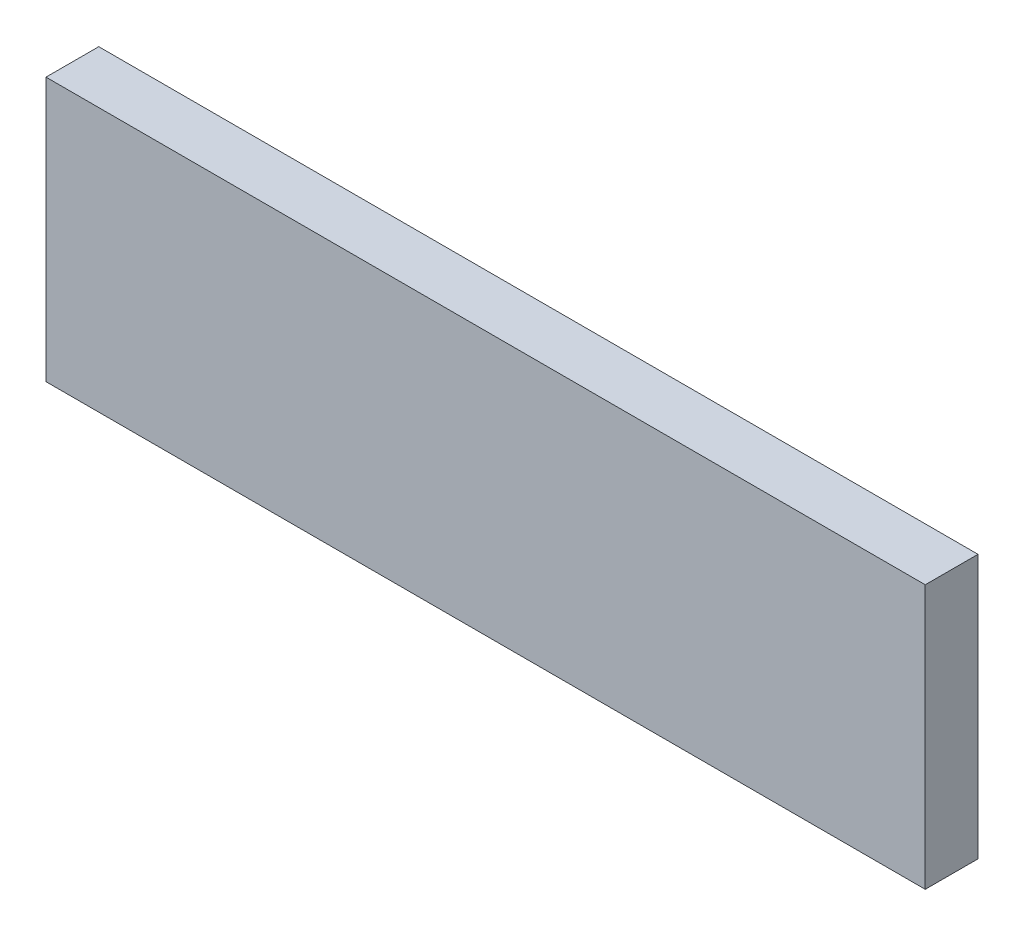
ISO-10303-21;
HEADER;
FILE_DESCRIPTION(('STEP AP214'),'2;1');
FILE_NAME('part.step','',(''),(''),'','','');
FILE_SCHEMA(('AUTOMOTIVE_DESIGN { 1 0 10303 214 1 1 1 1 }'));
ENDSEC;
DATA;
#1=APPLICATION_CONTEXT('core data for automotive mechanical design processes');
#2=APPLICATION_PROTOCOL_DEFINITION('international standard','automotive_design',2000,#1);
#3=PRODUCT_CONTEXT('',#1,'mechanical');
#4=PRODUCT('Part','Part','',(#3));
#5=PRODUCT_RELATED_PRODUCT_CATEGORY('part','',(#4));
#6=PRODUCT_DEFINITION_FORMATION('','',#4);
#7=PRODUCT_DEFINITION_CONTEXT('part definition',#1,'design');
#8=PRODUCT_DEFINITION('design','',#6,#7);
#9=PRODUCT_DEFINITION_SHAPE('','',#8);
#10=(LENGTH_UNIT() NAMED_UNIT(*) SI_UNIT(.MILLI.,.METRE.));
#11=(NAMED_UNIT(*) PLANE_ANGLE_UNIT() SI_UNIT($,.RADIAN.));
#12=(NAMED_UNIT(*) SI_UNIT($,.STERADIAN.) SOLID_ANGLE_UNIT());
#13=UNCERTAINTY_MEASURE_WITH_UNIT(LENGTH_MEASURE(1.E-05),#10,'distance_accuracy_value','');
#14=(GEOMETRIC_REPRESENTATION_CONTEXT(3) GLOBAL_UNCERTAINTY_ASSIGNED_CONTEXT((#13)) GLOBAL_UNIT_ASSIGNED_CONTEXT((#10,
#11,#12)) REPRESENTATION_CONTEXT('',''));
#15=CARTESIAN_POINT('',(0.,0.,0.));
#16=DIRECTION('',(0.,0.,1.));
#17=DIRECTION('',(1.,0.,0.));
#18=AXIS2_PLACEMENT_3D('',#15,#16,#17);
#19=CARTESIAN_POINT('',(0.,0.,3.));
#20=DIRECTION('',(1.,0.,0.));
#21=DIRECTION('',(0.,0.,-1.));
#22=AXIS2_PLACEMENT_3D('',#19,#20,#21);
#23=PLANE('',#22);
#24=DIRECTION('',(0.,-1.,0.));
#25=VECTOR('',#24,1.);
#26=CARTESIAN_POINT('',(0.,0.,0.));
#27=LINE('',#26,#25);
#28=CARTESIAN_POINT('',(0.,15.,0.));
#29=VERTEX_POINT('',#28);
#30=CARTESIAN_POINT('',(0.,0.,0.));
#31=VERTEX_POINT('',#30);
#32=EDGE_CURVE('E105',#29,#31,#27,.T.);
#33=ORIENTED_EDGE('',*,*,#32,.T.);
#34=DIRECTION('',(0.,0.,-1.));
#35=VECTOR('',#34,1.);
#36=CARTESIAN_POINT('',(0.,0.,3.));
#37=LINE('',#36,#35);
#38=CARTESIAN_POINT('',(0.,0.,3.));
#39=VERTEX_POINT('',#38);
#40=EDGE_CURVE('E11',#39,#31,#37,.T.);
#41=ORIENTED_EDGE('',*,*,#40,.F.);
#42=DIRECTION('',(0.,-1.,0.));
#43=VECTOR('',#42,1.);
#44=CARTESIAN_POINT('',(0.,0.,3.));
#45=LINE('',#44,#43);
#46=CARTESIAN_POINT('',(0.,15.,3.));
#47=VERTEX_POINT('',#46);
#48=EDGE_CURVE('E89',#47,#39,#45,.T.);
#49=ORIENTED_EDGE('',*,*,#48,.F.);
#50=DIRECTION('',(0.,0.,-1.));
#51=VECTOR('',#50,1.);
#52=CARTESIAN_POINT('',(0.,15.,3.));
#53=LINE('',#52,#51);
#54=EDGE_CURVE('E98',#47,#29,#53,.T.);
#55=ORIENTED_EDGE('',*,*,#54,.T.);
#56=EDGE_LOOP('',(#33,#41,#49,#55));
#57=FACE_BOUND('',#56,.T.);
#58=ADVANCED_FACE('F39',(#57),#23,.F.);
#59=CARTESIAN_POINT('',(0.,0.,3.));
#60=DIRECTION('',(0.,1.,0.));
#61=DIRECTION('',(0.,0.,1.));
#62=AXIS2_PLACEMENT_3D('',#59,#60,#61);
#63=PLANE('',#62);
#64=DIRECTION('',(1.,0.,0.));
#65=VECTOR('',#64,1.);
#66=CARTESIAN_POINT('',(0.,0.,0.));
#67=LINE('',#66,#65);
#68=CARTESIAN_POINT('',(50.,0.,0.));
#69=VERTEX_POINT('',#68);
#70=EDGE_CURVE('E94',#31,#69,#67,.T.);
#71=ORIENTED_EDGE('',*,*,#70,.T.);
#72=DIRECTION('',(0.,0.,-1.));
#73=VECTOR('',#72,1.);
#74=CARTESIAN_POINT('',(50.,0.,3.));
#75=LINE('',#74,#73);
#76=CARTESIAN_POINT('',(50.,0.,3.));
#77=VERTEX_POINT('',#76);
#78=EDGE_CURVE('E50',#77,#69,#75,.T.);
#79=ORIENTED_EDGE('',*,*,#78,.F.);
#80=DIRECTION('',(1.,0.,0.));
#81=VECTOR('',#80,1.);
#82=CARTESIAN_POINT('',(0.,0.,3.));
#83=LINE('',#82,#81);
#84=EDGE_CURVE('E83',#39,#77,#83,.T.);
#85=ORIENTED_EDGE('',*,*,#84,.F.);
#86=ORIENTED_EDGE('',*,*,#40,.T.);
#87=EDGE_LOOP('',(#71,#79,#85,#86));
#88=FACE_BOUND('',#87,.T.);
#89=ADVANCED_FACE('F91',(#88),#63,.F.);
#90=CARTESIAN_POINT('',(50.,0.,3.));
#91=DIRECTION('',(-1.,0.,0.));
#92=DIRECTION('',(0.,0.,1.));
#93=AXIS2_PLACEMENT_3D('',#90,#91,#92);
#94=PLANE('',#93);
#95=DIRECTION('',(0.,1.,0.));
#96=VECTOR('',#95,1.);
#97=CARTESIAN_POINT('',(50.,0.,0.));
#98=LINE('',#97,#96);
#99=CARTESIAN_POINT('',(50.,15.,0.));
#100=VERTEX_POINT('',#99);
#101=EDGE_CURVE('E75',#69,#100,#98,.T.);
#102=ORIENTED_EDGE('',*,*,#101,.T.);
#103=DIRECTION('',(0.,0.,-1.));
#104=VECTOR('',#103,1.);
#105=CARTESIAN_POINT('',(50.,15.,3.));
#106=LINE('',#105,#104);
#107=CARTESIAN_POINT('',(50.,15.,3.));
#108=VERTEX_POINT('',#107);
#109=EDGE_CURVE('E92',#108,#100,#106,.T.);
#110=ORIENTED_EDGE('',*,*,#109,.F.);
#111=DIRECTION('',(0.,1.,0.));
#112=VECTOR('',#111,1.);
#113=CARTESIAN_POINT('',(50.,0.,3.));
#114=LINE('',#113,#112);
#115=EDGE_CURVE('E86',#77,#108,#114,.T.);
#116=ORIENTED_EDGE('',*,*,#115,.F.);
#117=ORIENTED_EDGE('',*,*,#78,.T.);
#118=EDGE_LOOP('',(#102,#110,#116,#117));
#119=FACE_BOUND('',#118,.T.);
#120=ADVANCED_FACE('F96',(#119),#94,.F.);
#121=CARTESIAN_POINT('',(0.,15.,3.));
#122=DIRECTION('',(0.,-1.,0.));
#123=DIRECTION('',(0.,0.,-1.));
#124=AXIS2_PLACEMENT_3D('',#121,#122,#123);
#125=PLANE('',#124);
#126=DIRECTION('',(-1.,0.,0.));
#127=VECTOR('',#126,1.);
#128=CARTESIAN_POINT('',(0.,15.,0.));
#129=LINE('',#128,#127);
#130=EDGE_CURVE('E79',#100,#29,#129,.T.);
#131=ORIENTED_EDGE('',*,*,#130,.T.);
#132=ORIENTED_EDGE('',*,*,#54,.F.);
#133=DIRECTION('',(-1.,0.,0.));
#134=VECTOR('',#133,1.);
#135=CARTESIAN_POINT('',(0.,15.,3.));
#136=LINE('',#135,#134);
#137=EDGE_CURVE('E54',#108,#47,#136,.T.);
#138=ORIENTED_EDGE('',*,*,#137,.F.);
#139=ORIENTED_EDGE('',*,*,#109,.T.);
#140=EDGE_LOOP('',(#131,#132,#138,#139));
#141=FACE_BOUND('',#140,.T.);
#142=ADVANCED_FACE('F108',(#141),#125,.F.);
#143=CARTESIAN_POINT('',(0.,0.,3.));
#144=DIRECTION('',(0.,0.,-1.));
#145=DIRECTION('',(-1.,0.,0.));
#146=AXIS2_PLACEMENT_3D('',#143,#144,#145);
#147=PLANE('',#146);
#148=ORIENTED_EDGE('',*,*,#48,.T.);
#149=ORIENTED_EDGE('',*,*,#84,.T.);
#150=ORIENTED_EDGE('',*,*,#115,.T.);
#151=ORIENTED_EDGE('',*,*,#137,.T.);
#152=EDGE_LOOP('',(#148,#149,#150,#151));
#153=FACE_BOUND('',#152,.T.);
#154=ADVANCED_FACE('F88',(#153),#147,.F.);
#155=CARTESIAN_POINT('',(0.,0.,0.));
#156=DIRECTION('',(0.,0.,-1.));
#157=DIRECTION('',(-1.,0.,0.));
#158=AXIS2_PLACEMENT_3D('',#155,#156,#157);
#159=PLANE('',#158);
#160=ORIENTED_EDGE('',*,*,#32,.F.);
#161=ORIENTED_EDGE('',*,*,#130,.F.);
#162=ORIENTED_EDGE('',*,*,#101,.F.);
#163=ORIENTED_EDGE('',*,*,#70,.F.);
#164=EDGE_LOOP('',(#160,#161,#162,#163));
#165=FACE_BOUND('',#164,.T.);
#166=ADVANCED_FACE('F115',(#165),#159,.T.);
#167=CLOSED_SHELL('',(#58,#89,#120,#142,#154,#166));
#168=MANIFOLD_SOLID_BREP('B2',#167);
#169=ADVANCED_BREP_SHAPE_REPRESENTATION('',(#18,#168),#14);
#170=SHAPE_DEFINITION_REPRESENTATION(#9,#169);
ENDSEC;
END-ISO-10303-21;
